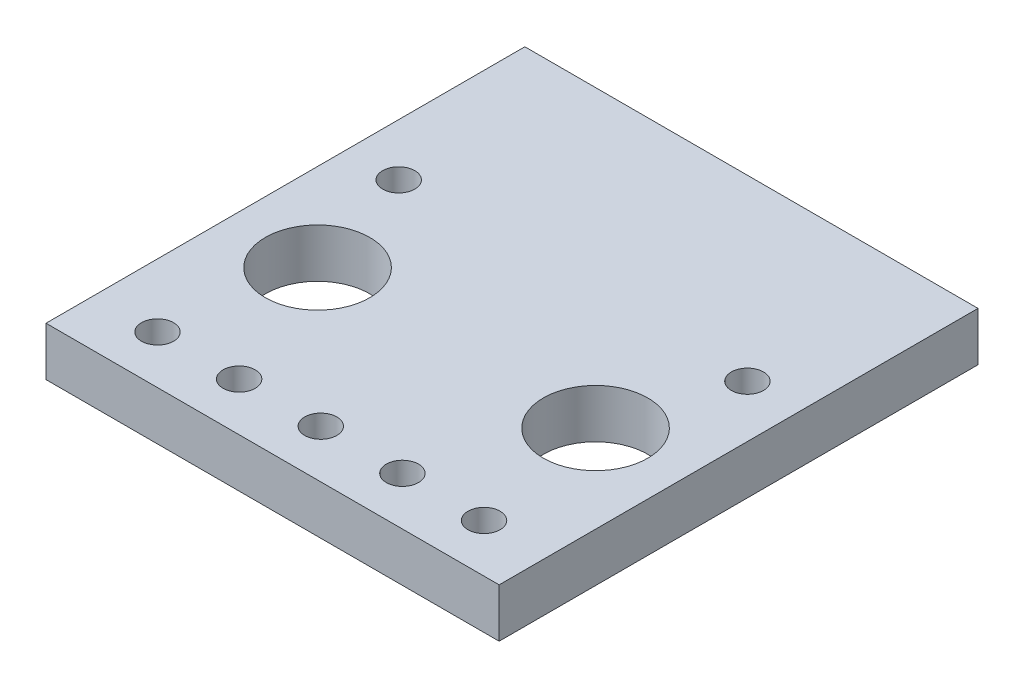
ISO-10303-21;
HEADER;
FILE_DESCRIPTION(('STEP AP214'),'2;1');
FILE_NAME('part.step','',(''),(''),'','','');
FILE_SCHEMA(('AUTOMOTIVE_DESIGN { 1 0 10303 214 1 1 1 1 }'));
ENDSEC;
DATA;
#1=APPLICATION_CONTEXT('core data for automotive mechanical design processes');
#2=APPLICATION_PROTOCOL_DEFINITION('international standard','automotive_design',2000,#1);
#3=PRODUCT_CONTEXT('',#1,'mechanical');
#4=PRODUCT('Part','Part','',(#3));
#5=PRODUCT_RELATED_PRODUCT_CATEGORY('part','',(#4));
#6=PRODUCT_DEFINITION_FORMATION('','',#4);
#7=PRODUCT_DEFINITION_CONTEXT('part definition',#1,'design');
#8=PRODUCT_DEFINITION('design','',#6,#7);
#9=PRODUCT_DEFINITION_SHAPE('','',#8);
#10=(LENGTH_UNIT() NAMED_UNIT(*) SI_UNIT(.MILLI.,.METRE.));
#11=(NAMED_UNIT(*) PLANE_ANGLE_UNIT() SI_UNIT($,.RADIAN.));
#12=(NAMED_UNIT(*) SI_UNIT($,.STERADIAN.) SOLID_ANGLE_UNIT());
#13=UNCERTAINTY_MEASURE_WITH_UNIT(LENGTH_MEASURE(1.E-05),#10,'distance_accuracy_value','');
#14=(GEOMETRIC_REPRESENTATION_CONTEXT(3) GLOBAL_UNCERTAINTY_ASSIGNED_CONTEXT((#13)) GLOBAL_UNIT_ASSIGNED_CONTEXT((#10,
#11,#12)) REPRESENTATION_CONTEXT('',''));
#15=CARTESIAN_POINT('',(0.,0.,0.));
#16=DIRECTION('',(0.,0.,1.));
#17=DIRECTION('',(1.,0.,0.));
#18=AXIS2_PLACEMENT_3D('',#15,#16,#17);
#19=CARTESIAN_POINT('',(0.,1.52,0.));
#20=DIRECTION('',(0.,-1.,0.));
#21=DIRECTION('',(0.,0.,-1.));
#22=AXIS2_PLACEMENT_3D('',#19,#20,#21);
#23=PLANE('',#22);
#24=DIRECTION('',(0.,0.,1.));
#25=VECTOR('',#24,1.);
#26=CARTESIAN_POINT('',(0.,1.52,0.));
#27=LINE('',#26,#25);
#28=CARTESIAN_POINT('',(0.,1.52,-14.9));
#29=VERTEX_POINT('',#28);
#30=CARTESIAN_POINT('',(0.,1.52,0.));
#31=VERTEX_POINT('',#30);
#32=EDGE_CURVE('E86',#29,#31,#27,.T.);
#33=ORIENTED_EDGE('',*,*,#32,.T.);
#34=DIRECTION('',(1.,0.,0.));
#35=VECTOR('',#34,1.);
#36=CARTESIAN_POINT('',(0.,1.52,0.));
#37=LINE('',#36,#35);
#38=CARTESIAN_POINT('',(14.1,1.52,0.));
#39=VERTEX_POINT('',#38);
#40=EDGE_CURVE('E81',#31,#39,#37,.T.);
#41=ORIENTED_EDGE('',*,*,#40,.T.);
#42=DIRECTION('',(0.,0.,-1.));
#43=VECTOR('',#42,1.);
#44=CARTESIAN_POINT('',(14.1,1.52,0.));
#45=LINE('',#44,#43);
#46=CARTESIAN_POINT('',(14.1,1.52,-14.9));
#47=VERTEX_POINT('',#46);
#48=EDGE_CURVE('E84',#39,#47,#45,.T.);
#49=ORIENTED_EDGE('',*,*,#48,.T.);
#50=DIRECTION('',(-1.,0.,0.));
#51=VECTOR('',#50,1.);
#52=CARTESIAN_POINT('',(0.,1.52,-14.9));
#53=LINE('',#52,#51);
#54=EDGE_CURVE('E51',#47,#29,#53,.T.);
#55=ORIENTED_EDGE('',*,*,#54,.T.);
#56=EDGE_LOOP('',(#33,#41,#49,#55));
#57=FACE_BOUND('',#56,.T.);
#58=CARTESIAN_POINT('',(2.725,1.52,-5.725));
#59=DIRECTION('',(0.,1.,0.));
#60=DIRECTION('',(0.,0.,1.));
#61=AXIS2_PLACEMENT_3D('',#58,#59,#60);
#62=CIRCLE('',#61,1.625);
#63=CARTESIAN_POINT('',(2.725,1.52,-4.1));
#64=VERTEX_POINT('',#63);
#65=EDGE_CURVE('E101',#64,#64,#62,.T.);
#66=ORIENTED_EDGE('',*,*,#65,.F.);
#67=EDGE_LOOP('',(#66));
#68=FACE_BOUND('',#67,.T.);
#69=CARTESIAN_POINT('',(11.375,1.52,-5.725));
#70=DIRECTION('',(0.,1.,0.));
#71=DIRECTION('',(0.,0.,1.));
#72=AXIS2_PLACEMENT_3D('',#69,#70,#71);
#73=CIRCLE('',#72,1.625);
#74=CARTESIAN_POINT('',(11.375,1.52,-4.1));
#75=VERTEX_POINT('',#74);
#76=EDGE_CURVE('E116',#75,#75,#73,.T.);
#77=ORIENTED_EDGE('',*,*,#76,.F.);
#78=EDGE_LOOP('',(#77));
#79=FACE_BOUND('',#78,.T.);
#80=CARTESIAN_POINT('',(1.97,1.52,-1.5));
#81=DIRECTION('',(0.,1.,0.));
#82=DIRECTION('',(0.,0.,1.));
#83=AXIS2_PLACEMENT_3D('',#80,#81,#82);
#84=CIRCLE('',#83,0.5);
#85=CARTESIAN_POINT('',(1.97,1.52,-1.));
#86=VERTEX_POINT('',#85);
#87=EDGE_CURVE('E122',#86,#86,#84,.T.);
#88=ORIENTED_EDGE('',*,*,#87,.F.);
#89=EDGE_LOOP('',(#88));
#90=FACE_BOUND('',#89,.T.);
#91=CARTESIAN_POINT('',(4.51,1.52,-1.5));
#92=DIRECTION('',(0.,1.,0.));
#93=DIRECTION('',(0.,0.,1.));
#94=AXIS2_PLACEMENT_3D('',#91,#92,#93);
#95=CIRCLE('',#94,0.5);
#96=CARTESIAN_POINT('',(4.51,1.52,-1.));
#97=VERTEX_POINT('',#96);
#98=EDGE_CURVE('E128',#97,#97,#95,.T.);
#99=ORIENTED_EDGE('',*,*,#98,.F.);
#100=EDGE_LOOP('',(#99));
#101=FACE_BOUND('',#100,.T.);
#102=CARTESIAN_POINT('',(7.05,1.52,-1.5));
#103=DIRECTION('',(0.,1.,0.));
#104=DIRECTION('',(0.,0.,1.));
#105=AXIS2_PLACEMENT_3D('',#102,#103,#104);
#106=CIRCLE('',#105,0.5);
#107=CARTESIAN_POINT('',(7.05,1.52,-1.));
#108=VERTEX_POINT('',#107);
#109=EDGE_CURVE('E134',#108,#108,#106,.T.);
#110=ORIENTED_EDGE('',*,*,#109,.F.);
#111=EDGE_LOOP('',(#110));
#112=FACE_BOUND('',#111,.T.);
#113=CARTESIAN_POINT('',(9.59,1.52,-1.5));
#114=DIRECTION('',(0.,1.,0.));
#115=DIRECTION('',(0.,0.,1.));
#116=AXIS2_PLACEMENT_3D('',#113,#114,#115);
#117=CIRCLE('',#116,0.500000000000001);
#118=CARTESIAN_POINT('',(9.59,1.52,-0.999999999999999));
#119=VERTEX_POINT('',#118);
#120=EDGE_CURVE('E140',#119,#119,#117,.T.);
#121=ORIENTED_EDGE('',*,*,#120,.F.);
#122=EDGE_LOOP('',(#121));
#123=FACE_BOUND('',#122,.T.);
#124=CARTESIAN_POINT('',(12.13,1.52,-1.5));
#125=DIRECTION('',(0.,1.,0.));
#126=DIRECTION('',(0.,0.,1.));
#127=AXIS2_PLACEMENT_3D('',#124,#125,#126);
#128=CIRCLE('',#127,0.500000000000001);
#129=CARTESIAN_POINT('',(12.13,1.52,-0.999999999999999));
#130=VERTEX_POINT('',#129);
#131=EDGE_CURVE('E146',#130,#130,#128,.T.);
#132=ORIENTED_EDGE('',*,*,#131,.F.);
#133=EDGE_LOOP('',(#132));
#134=FACE_BOUND('',#133,.T.);
#135=CARTESIAN_POINT('',(1.625,1.52,-9.35));
#136=DIRECTION('',(0.,1.,0.));
#137=DIRECTION('',(0.,0.,1.));
#138=AXIS2_PLACEMENT_3D('',#135,#136,#137);
#139=CIRCLE('',#138,0.500000000000001);
#140=CARTESIAN_POINT('',(1.625,1.52,-8.85));
#141=VERTEX_POINT('',#140);
#142=EDGE_CURVE('E152',#141,#141,#139,.T.);
#143=ORIENTED_EDGE('',*,*,#142,.F.);
#144=EDGE_LOOP('',(#143));
#145=FACE_BOUND('',#144,.T.);
#146=CARTESIAN_POINT('',(12.475,1.52,-9.35));
#147=DIRECTION('',(0.,1.,0.));
#148=DIRECTION('',(0.,0.,1.));
#149=AXIS2_PLACEMENT_3D('',#146,#147,#148);
#150=CIRCLE('',#149,0.500000000000001);
#151=CARTESIAN_POINT('',(12.475,1.52,-8.85));
#152=VERTEX_POINT('',#151);
#153=EDGE_CURVE('E158',#152,#152,#150,.T.);
#154=ORIENTED_EDGE('',*,*,#153,.F.);
#155=EDGE_LOOP('',(#154));
#156=FACE_BOUND('',#155,.T.);
#157=ADVANCED_FACE('F34',(#57,#68,#79,#90,#101,#112,#123,#134,#145,#156),#23,.F.);
#158=CARTESIAN_POINT('',(0.,0.,0.));
#159=DIRECTION('',(0.,-1.,0.));
#160=DIRECTION('',(0.,0.,-1.));
#161=AXIS2_PLACEMENT_3D('',#158,#159,#160);
#162=PLANE('',#161);
#163=CARTESIAN_POINT('',(1.625,0.,-9.35));
#164=DIRECTION('',(0.,1.,0.));
#165=DIRECTION('',(0.,0.,1.));
#166=AXIS2_PLACEMENT_3D('',#163,#164,#165);
#167=CIRCLE('',#166,0.500000000000001);
#168=CARTESIAN_POINT('',(1.625,0.,-8.85));
#169=VERTEX_POINT('',#168);
#170=EDGE_CURVE('E155',#169,#169,#167,.T.);
#171=ORIENTED_EDGE('',*,*,#170,.T.);
#172=EDGE_LOOP('',(#171));
#173=FACE_BOUND('',#172,.T.);
#174=CARTESIAN_POINT('',(9.59,0.,-1.5));
#175=DIRECTION('',(0.,1.,0.));
#176=DIRECTION('',(0.,0.,1.));
#177=AXIS2_PLACEMENT_3D('',#174,#175,#176);
#178=CIRCLE('',#177,0.500000000000001);
#179=CARTESIAN_POINT('',(9.59,0.,-0.999999999999999));
#180=VERTEX_POINT('',#179);
#181=EDGE_CURVE('E143',#180,#180,#178,.T.);
#182=ORIENTED_EDGE('',*,*,#181,.T.);
#183=EDGE_LOOP('',(#182));
#184=FACE_BOUND('',#183,.T.);
#185=CARTESIAN_POINT('',(4.51,0.,-1.5));
#186=DIRECTION('',(0.,1.,0.));
#187=DIRECTION('',(0.,0.,1.));
#188=AXIS2_PLACEMENT_3D('',#185,#186,#187);
#189=CIRCLE('',#188,0.5);
#190=CARTESIAN_POINT('',(4.51,0.,-1.));
#191=VERTEX_POINT('',#190);
#192=EDGE_CURVE('E131',#191,#191,#189,.T.);
#193=ORIENTED_EDGE('',*,*,#192,.T.);
#194=EDGE_LOOP('',(#193));
#195=FACE_BOUND('',#194,.T.);
#196=CARTESIAN_POINT('',(11.375,0.,-5.725));
#197=DIRECTION('',(0.,1.,0.));
#198=DIRECTION('',(0.,0.,1.));
#199=AXIS2_PLACEMENT_3D('',#196,#197,#198);
#200=CIRCLE('',#199,1.625);
#201=CARTESIAN_POINT('',(11.375,0.,-4.1));
#202=VERTEX_POINT('',#201);
#203=EDGE_CURVE('E119',#202,#202,#200,.T.);
#204=ORIENTED_EDGE('',*,*,#203,.T.);
#205=EDGE_LOOP('',(#204));
#206=FACE_BOUND('',#205,.T.);
#207=DIRECTION('',(0.,0.,1.));
#208=VECTOR('',#207,1.);
#209=CARTESIAN_POINT('',(0.,0.,0.));
#210=LINE('',#209,#208);
#211=CARTESIAN_POINT('',(0.,0.,-14.9));
#212=VERTEX_POINT('',#211);
#213=CARTESIAN_POINT('',(0.,0.,0.));
#214=VERTEX_POINT('',#213);
#215=EDGE_CURVE('E98',#212,#214,#210,.T.);
#216=ORIENTED_EDGE('',*,*,#215,.F.);
#217=DIRECTION('',(-1.,0.,0.));
#218=VECTOR('',#217,1.);
#219=CARTESIAN_POINT('',(0.,0.,-14.9));
#220=LINE('',#219,#218);
#221=CARTESIAN_POINT('',(14.1,0.,-14.9));
#222=VERTEX_POINT('',#221);
#223=EDGE_CURVE('E74',#222,#212,#220,.T.);
#224=ORIENTED_EDGE('',*,*,#223,.F.);
#225=DIRECTION('',(0.,0.,-1.));
#226=VECTOR('',#225,1.);
#227=CARTESIAN_POINT('',(14.1,0.,0.));
#228=LINE('',#227,#226);
#229=CARTESIAN_POINT('',(14.1,0.,0.));
#230=VERTEX_POINT('',#229);
#231=EDGE_CURVE('E68',#230,#222,#228,.T.);
#232=ORIENTED_EDGE('',*,*,#231,.F.);
#233=DIRECTION('',(1.,0.,0.));
#234=VECTOR('',#233,1.);
#235=CARTESIAN_POINT('',(0.,0.,0.));
#236=LINE('',#235,#234);
#237=EDGE_CURVE('E90',#214,#230,#236,.T.);
#238=ORIENTED_EDGE('',*,*,#237,.F.);
#239=EDGE_LOOP('',(#216,#224,#232,#238));
#240=FACE_BOUND('',#239,.T.);
#241=CARTESIAN_POINT('',(2.725,0.,-5.725));
#242=DIRECTION('',(0.,1.,0.));
#243=DIRECTION('',(0.,0.,1.));
#244=AXIS2_PLACEMENT_3D('',#241,#242,#243);
#245=CIRCLE('',#244,1.625);
#246=CARTESIAN_POINT('',(2.725,0.,-4.1));
#247=VERTEX_POINT('',#246);
#248=EDGE_CURVE('E113',#247,#247,#245,.T.);
#249=ORIENTED_EDGE('',*,*,#248,.T.);
#250=EDGE_LOOP('',(#249));
#251=FACE_BOUND('',#250,.T.);
#252=CARTESIAN_POINT('',(1.97,0.,-1.5));
#253=DIRECTION('',(0.,1.,0.));
#254=DIRECTION('',(0.,0.,1.));
#255=AXIS2_PLACEMENT_3D('',#252,#253,#254);
#256=CIRCLE('',#255,0.5);
#257=CARTESIAN_POINT('',(1.97,0.,-1.));
#258=VERTEX_POINT('',#257);
#259=EDGE_CURVE('E125',#258,#258,#256,.T.);
#260=ORIENTED_EDGE('',*,*,#259,.T.);
#261=EDGE_LOOP('',(#260));
#262=FACE_BOUND('',#261,.T.);
#263=CARTESIAN_POINT('',(7.05,0.,-1.5));
#264=DIRECTION('',(0.,1.,0.));
#265=DIRECTION('',(0.,0.,1.));
#266=AXIS2_PLACEMENT_3D('',#263,#264,#265);
#267=CIRCLE('',#266,0.5);
#268=CARTESIAN_POINT('',(7.05,0.,-1.));
#269=VERTEX_POINT('',#268);
#270=EDGE_CURVE('E137',#269,#269,#267,.T.);
#271=ORIENTED_EDGE('',*,*,#270,.T.);
#272=EDGE_LOOP('',(#271));
#273=FACE_BOUND('',#272,.T.);
#274=CARTESIAN_POINT('',(12.13,0.,-1.5));
#275=DIRECTION('',(0.,1.,0.));
#276=DIRECTION('',(0.,0.,1.));
#277=AXIS2_PLACEMENT_3D('',#274,#275,#276);
#278=CIRCLE('',#277,0.500000000000001);
#279=CARTESIAN_POINT('',(12.13,0.,-0.999999999999999));
#280=VERTEX_POINT('',#279);
#281=EDGE_CURVE('E149',#280,#280,#278,.T.);
#282=ORIENTED_EDGE('',*,*,#281,.T.);
#283=EDGE_LOOP('',(#282));
#284=FACE_BOUND('',#283,.T.);
#285=CARTESIAN_POINT('',(12.475,0.,-9.35));
#286=DIRECTION('',(0.,1.,0.));
#287=DIRECTION('',(0.,0.,1.));
#288=AXIS2_PLACEMENT_3D('',#285,#286,#287);
#289=CIRCLE('',#288,0.500000000000001);
#290=CARTESIAN_POINT('',(12.475,0.,-8.85));
#291=VERTEX_POINT('',#290);
#292=EDGE_CURVE('E161',#291,#291,#289,.T.);
#293=ORIENTED_EDGE('',*,*,#292,.T.);
#294=EDGE_LOOP('',(#293));
#295=FACE_BOUND('',#294,.T.);
#296=ADVANCED_FACE('F109',(#173,#184,#195,#206,#240,#251,#262,#273,#284,#295),#162,.T.);
#297=CARTESIAN_POINT('',(0.,1.52,0.));
#298=DIRECTION('',(1.,0.,0.));
#299=DIRECTION('',(0.,0.,-1.));
#300=AXIS2_PLACEMENT_3D('',#297,#298,#299);
#301=PLANE('',#300);
#302=ORIENTED_EDGE('',*,*,#215,.T.);
#303=DIRECTION('',(0.,-1.,0.));
#304=VECTOR('',#303,1.);
#305=CARTESIAN_POINT('',(0.,1.52,0.));
#306=LINE('',#305,#304);
#307=EDGE_CURVE('E11',#31,#214,#306,.T.);
#308=ORIENTED_EDGE('',*,*,#307,.F.);
#309=ORIENTED_EDGE('',*,*,#32,.F.);
#310=DIRECTION('',(0.,-1.,0.));
#311=VECTOR('',#310,1.);
#312=CARTESIAN_POINT('',(0.,1.52,-14.9));
#313=LINE('',#312,#311);
#314=EDGE_CURVE('E94',#29,#212,#313,.T.);
#315=ORIENTED_EDGE('',*,*,#314,.T.);
#316=EDGE_LOOP('',(#302,#308,#309,#315));
#317=FACE_BOUND('',#316,.T.);
#318=ADVANCED_FACE('F36',(#317),#301,.F.);
#319=CARTESIAN_POINT('',(0.,1.52,0.));
#320=DIRECTION('',(0.,0.,-1.));
#321=DIRECTION('',(-1.,0.,0.));
#322=AXIS2_PLACEMENT_3D('',#319,#320,#321);
#323=PLANE('',#322);
#324=ORIENTED_EDGE('',*,*,#237,.T.);
#325=DIRECTION('',(0.,-1.,0.));
#326=VECTOR('',#325,1.);
#327=CARTESIAN_POINT('',(14.1,1.52,0.));
#328=LINE('',#327,#326);
#329=EDGE_CURVE('E43',#39,#230,#328,.T.);
#330=ORIENTED_EDGE('',*,*,#329,.F.);
#331=ORIENTED_EDGE('',*,*,#40,.F.);
#332=ORIENTED_EDGE('',*,*,#307,.T.);
#333=EDGE_LOOP('',(#324,#330,#331,#332));
#334=FACE_BOUND('',#333,.T.);
#335=ADVANCED_FACE('F89',(#334),#323,.F.);
#336=CARTESIAN_POINT('',(14.1,1.52,0.));
#337=DIRECTION('',(-1.,0.,0.));
#338=DIRECTION('',(0.,0.,1.));
#339=AXIS2_PLACEMENT_3D('',#336,#337,#338);
#340=PLANE('',#339);
#341=ORIENTED_EDGE('',*,*,#231,.T.);
#342=DIRECTION('',(0.,-1.,0.));
#343=VECTOR('',#342,1.);
#344=CARTESIAN_POINT('',(14.1,1.52,-14.9));
#345=LINE('',#344,#343);
#346=EDGE_CURVE('E91',#47,#222,#345,.T.);
#347=ORIENTED_EDGE('',*,*,#346,.F.);
#348=ORIENTED_EDGE('',*,*,#48,.F.);
#349=ORIENTED_EDGE('',*,*,#329,.T.);
#350=EDGE_LOOP('',(#341,#347,#348,#349));
#351=FACE_BOUND('',#350,.T.);
#352=ADVANCED_FACE('F92',(#351),#340,.F.);
#353=CARTESIAN_POINT('',(0.,1.52,-14.9));
#354=DIRECTION('',(0.,0.,1.));
#355=DIRECTION('',(1.,0.,0.));
#356=AXIS2_PLACEMENT_3D('',#353,#354,#355);
#357=PLANE('',#356);
#358=ORIENTED_EDGE('',*,*,#223,.T.);
#359=ORIENTED_EDGE('',*,*,#314,.F.);
#360=ORIENTED_EDGE('',*,*,#54,.F.);
#361=ORIENTED_EDGE('',*,*,#346,.T.);
#362=EDGE_LOOP('',(#358,#359,#360,#361));
#363=FACE_BOUND('',#362,.T.);
#364=ADVANCED_FACE('F106',(#363),#357,.F.);
#365=CARTESIAN_POINT('',(2.725,1.52,-5.725));
#366=DIRECTION('',(0.,-1.,0.));
#367=DIRECTION('',(0.,0.,-1.));
#368=AXIS2_PLACEMENT_3D('',#365,#366,#367);
#369=CYLINDRICAL_SURFACE('',#368,1.625);
#370=ORIENTED_EDGE('',*,*,#65,.T.);
#371=EDGE_LOOP('',(#370));
#372=FACE_BOUND('',#371,.T.);
#373=ORIENTED_EDGE('',*,*,#248,.F.);
#374=EDGE_LOOP('',(#373));
#375=FACE_BOUND('',#374,.T.);
#376=ADVANCED_FACE('F178',(#372,#375),#369,.F.);
#377=CARTESIAN_POINT('',(11.375,1.52,-5.725));
#378=DIRECTION('',(0.,-1.,0.));
#379=DIRECTION('',(0.,0.,-1.));
#380=AXIS2_PLACEMENT_3D('',#377,#378,#379);
#381=CYLINDRICAL_SURFACE('',#380,1.625);
#382=ORIENTED_EDGE('',*,*,#76,.T.);
#383=EDGE_LOOP('',(#382));
#384=FACE_BOUND('',#383,.T.);
#385=ORIENTED_EDGE('',*,*,#203,.F.);
#386=EDGE_LOOP('',(#385));
#387=FACE_BOUND('',#386,.T.);
#388=ADVANCED_FACE('F226',(#384,#387),#381,.F.);
#389=CARTESIAN_POINT('',(1.97,1.52,-1.5));
#390=DIRECTION('',(0.,-1.,0.));
#391=DIRECTION('',(0.,0.,-1.));
#392=AXIS2_PLACEMENT_3D('',#389,#390,#391);
#393=CYLINDRICAL_SURFACE('',#392,0.5);
#394=ORIENTED_EDGE('',*,*,#87,.T.);
#395=EDGE_LOOP('',(#394));
#396=FACE_BOUND('',#395,.T.);
#397=ORIENTED_EDGE('',*,*,#259,.F.);
#398=EDGE_LOOP('',(#397));
#399=FACE_BOUND('',#398,.T.);
#400=ADVANCED_FACE('F234',(#396,#399),#393,.F.);
#401=CARTESIAN_POINT('',(4.51,1.52,-1.5));
#402=DIRECTION('',(0.,-1.,0.));
#403=DIRECTION('',(0.,0.,-1.));
#404=AXIS2_PLACEMENT_3D('',#401,#402,#403);
#405=CYLINDRICAL_SURFACE('',#404,0.5);
#406=ORIENTED_EDGE('',*,*,#98,.T.);
#407=EDGE_LOOP('',(#406));
#408=FACE_BOUND('',#407,.T.);
#409=ORIENTED_EDGE('',*,*,#192,.F.);
#410=EDGE_LOOP('',(#409));
#411=FACE_BOUND('',#410,.T.);
#412=ADVANCED_FACE('F242',(#408,#411),#405,.F.);
#413=CARTESIAN_POINT('',(7.05,1.52,-1.5));
#414=DIRECTION('',(0.,-1.,0.));
#415=DIRECTION('',(0.,0.,-1.));
#416=AXIS2_PLACEMENT_3D('',#413,#414,#415);
#417=CYLINDRICAL_SURFACE('',#416,0.5);
#418=ORIENTED_EDGE('',*,*,#109,.T.);
#419=EDGE_LOOP('',(#418));
#420=FACE_BOUND('',#419,.T.);
#421=ORIENTED_EDGE('',*,*,#270,.F.);
#422=EDGE_LOOP('',(#421));
#423=FACE_BOUND('',#422,.T.);
#424=ADVANCED_FACE('F251',(#420,#423),#417,.F.);
#425=CARTESIAN_POINT('',(9.59,1.52,-1.5));
#426=DIRECTION('',(0.,-1.,0.));
#427=DIRECTION('',(0.,0.,-1.));
#428=AXIS2_PLACEMENT_3D('',#425,#426,#427);
#429=CYLINDRICAL_SURFACE('',#428,0.500000000000001);
#430=ORIENTED_EDGE('',*,*,#120,.T.);
#431=EDGE_LOOP('',(#430));
#432=FACE_BOUND('',#431,.T.);
#433=ORIENTED_EDGE('',*,*,#181,.F.);
#434=EDGE_LOOP('',(#433));
#435=FACE_BOUND('',#434,.T.);
#436=ADVANCED_FACE('F260',(#432,#435),#429,.F.);
#437=CARTESIAN_POINT('',(12.13,1.52,-1.5));
#438=DIRECTION('',(0.,-1.,0.));
#439=DIRECTION('',(0.,0.,-1.));
#440=AXIS2_PLACEMENT_3D('',#437,#438,#439);
#441=CYLINDRICAL_SURFACE('',#440,0.500000000000001);
#442=ORIENTED_EDGE('',*,*,#131,.T.);
#443=EDGE_LOOP('',(#442));
#444=FACE_BOUND('',#443,.T.);
#445=ORIENTED_EDGE('',*,*,#281,.F.);
#446=EDGE_LOOP('',(#445));
#447=FACE_BOUND('',#446,.T.);
#448=ADVANCED_FACE('F269',(#444,#447),#441,.F.);
#449=CARTESIAN_POINT('',(1.625,1.52,-9.35));
#450=DIRECTION('',(0.,-1.,0.));
#451=DIRECTION('',(0.,0.,-1.));
#452=AXIS2_PLACEMENT_3D('',#449,#450,#451);
#453=CYLINDRICAL_SURFACE('',#452,0.500000000000001);
#454=ORIENTED_EDGE('',*,*,#142,.T.);
#455=EDGE_LOOP('',(#454));
#456=FACE_BOUND('',#455,.T.);
#457=ORIENTED_EDGE('',*,*,#170,.F.);
#458=EDGE_LOOP('',(#457));
#459=FACE_BOUND('',#458,.T.);
#460=ADVANCED_FACE('F278',(#456,#459),#453,.F.);
#461=CARTESIAN_POINT('',(12.475,1.52,-9.35));
#462=DIRECTION('',(0.,-1.,0.));
#463=DIRECTION('',(0.,0.,-1.));
#464=AXIS2_PLACEMENT_3D('',#461,#462,#463);
#465=CYLINDRICAL_SURFACE('',#464,0.500000000000001);
#466=ORIENTED_EDGE('',*,*,#153,.T.);
#467=EDGE_LOOP('',(#466));
#468=FACE_BOUND('',#467,.T.);
#469=ORIENTED_EDGE('',*,*,#292,.F.);
#470=EDGE_LOOP('',(#469));
#471=FACE_BOUND('',#470,.T.);
#472=ADVANCED_FACE('F167',(#468,#471),#465,.F.);
#473=CLOSED_SHELL('',(#157,#296,#318,#335,#352,#364,#376,#388,#400,#412,#424,#436,#448,#460,#472));
#474=MANIFOLD_SOLID_BREP('B2',#473);
#475=ADVANCED_BREP_SHAPE_REPRESENTATION('',(#18,#474),#14);
#476=SHAPE_DEFINITION_REPRESENTATION(#9,#475);
ENDSEC;
END-ISO-10303-21;
